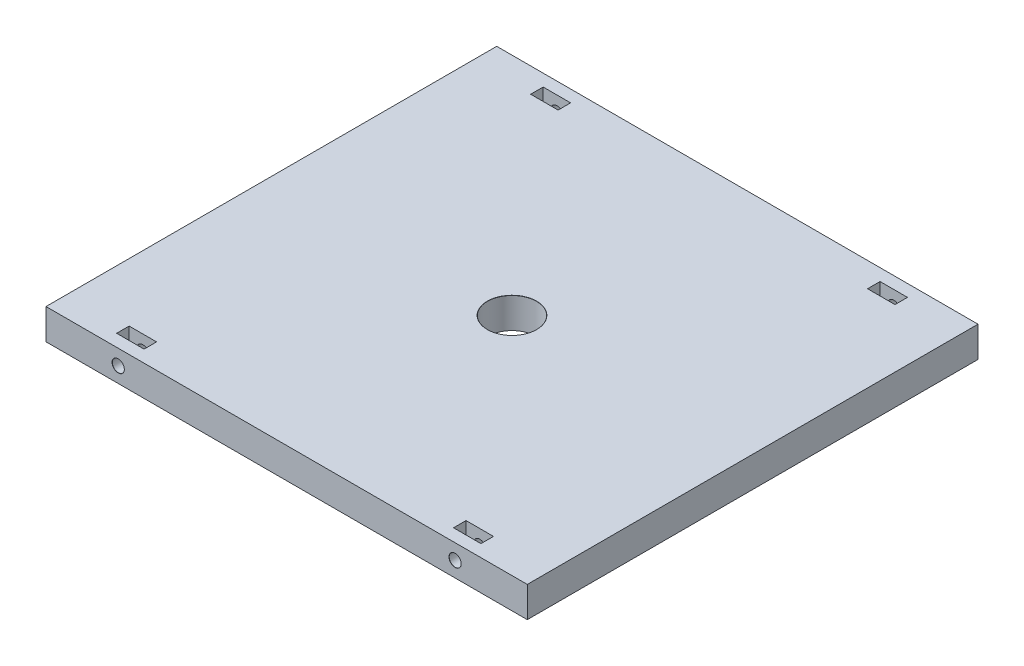
ISO-10303-21;
HEADER;
FILE_DESCRIPTION(('STEP AP214'),'2;1');
FILE_NAME('part.step','',(''),(''),'','','');
FILE_SCHEMA(('AUTOMOTIVE_DESIGN { 1 0 10303 214 1 1 1 1 }'));
ENDSEC;
DATA;
#1=APPLICATION_CONTEXT('core data for automotive mechanical design processes');
#2=APPLICATION_PROTOCOL_DEFINITION('international standard','automotive_design',2000,#1);
#3=PRODUCT_CONTEXT('',#1,'mechanical');
#4=PRODUCT('Part','Part','',(#3));
#5=PRODUCT_RELATED_PRODUCT_CATEGORY('part','',(#4));
#6=PRODUCT_DEFINITION_FORMATION('','',#4);
#7=PRODUCT_DEFINITION_CONTEXT('part definition',#1,'design');
#8=PRODUCT_DEFINITION('design','',#6,#7);
#9=PRODUCT_DEFINITION_SHAPE('','',#8);
#10=(LENGTH_UNIT() NAMED_UNIT(*) SI_UNIT(.MILLI.,.METRE.));
#11=(NAMED_UNIT(*) PLANE_ANGLE_UNIT() SI_UNIT($,.RADIAN.));
#12=(NAMED_UNIT(*) SI_UNIT($,.STERADIAN.) SOLID_ANGLE_UNIT());
#13=UNCERTAINTY_MEASURE_WITH_UNIT(LENGTH_MEASURE(1.E-05),#10,'distance_accuracy_value','');
#14=(GEOMETRIC_REPRESENTATION_CONTEXT(3) GLOBAL_UNCERTAINTY_ASSIGNED_CONTEXT((#13)) GLOBAL_UNIT_ASSIGNED_CONTEXT((#10,
#11,#12)) REPRESENTATION_CONTEXT('',''));
#15=CARTESIAN_POINT('',(0.,0.,0.));
#16=DIRECTION('',(0.,0.,1.));
#17=DIRECTION('',(1.,0.,0.));
#18=AXIS2_PLACEMENT_3D('',#15,#16,#17);
#19=CARTESIAN_POINT('',(35.,3.175,46.825));
#20=DIRECTION('',(0.,0.,1.));
#21=DIRECTION('',(1.,0.,0.));
#22=AXIS2_PLACEMENT_3D('',#19,#20,#21);
#23=CYLINDRICAL_SURFACE('',#22,1.24999999999999);
#24=CARTESIAN_POINT('',(35.,3.175,44.3));
#25=DIRECTION('',(0.,0.,1.));
#26=DIRECTION('',(1.,0.,0.));
#27=AXIS2_PLACEMENT_3D('',#24,#25,#26);
#28=CIRCLE('',#27,1.24999999999999);
#29=CARTESIAN_POINT('',(36.25,3.175,44.3));
#30=VERTEX_POINT('',#29);
#31=EDGE_CURVE('E46',#30,#30,#28,.F.);
#32=ORIENTED_EDGE('',*,*,#31,.T.);
#33=EDGE_LOOP('',(#32));
#34=FACE_BOUND('',#33,.T.);
#35=CARTESIAN_POINT('',(35.,3.175,46.8));
#36=DIRECTION('',(0.,0.,1.));
#37=DIRECTION('',(1.,0.,0.));
#38=AXIS2_PLACEMENT_3D('',#35,#36,#37);
#39=CIRCLE('',#38,1.24999999999999);
#40=CARTESIAN_POINT('',(36.25,3.175,46.8));
#41=VERTEX_POINT('',#40);
#42=EDGE_CURVE('E423',#41,#41,#39,.T.);
#43=ORIENTED_EDGE('',*,*,#42,.T.);
#44=EDGE_LOOP('',(#43));
#45=FACE_BOUND('',#44,.T.);
#46=ADVANCED_FACE('F42',(#34,#45),#23,.F.);
#47=CARTESIAN_POINT('',(-35.,3.175,46.825));
#48=DIRECTION('',(0.,0.,1.));
#49=DIRECTION('',(1.,0.,0.));
#50=AXIS2_PLACEMENT_3D('',#47,#48,#49);
#51=CYLINDRICAL_SURFACE('',#50,1.24999999999999);
#52=CARTESIAN_POINT('',(-35.,3.175,44.3));
#53=DIRECTION('',(0.,0.,1.));
#54=DIRECTION('',(1.,0.,0.));
#55=AXIS2_PLACEMENT_3D('',#52,#53,#54);
#56=CIRCLE('',#55,1.24999999999999);
#57=CARTESIAN_POINT('',(-33.75,3.175,44.3));
#58=VERTEX_POINT('',#57);
#59=EDGE_CURVE('E487',#58,#58,#56,.F.);
#60=ORIENTED_EDGE('',*,*,#59,.T.);
#61=EDGE_LOOP('',(#60));
#62=FACE_BOUND('',#61,.T.);
#63=CARTESIAN_POINT('',(-35.,3.175,46.8));
#64=DIRECTION('',(0.,0.,1.));
#65=DIRECTION('',(1.,0.,0.));
#66=AXIS2_PLACEMENT_3D('',#63,#64,#65);
#67=CIRCLE('',#66,1.24999999999999);
#68=CARTESIAN_POINT('',(-33.75,3.175,46.8));
#69=VERTEX_POINT('',#68);
#70=EDGE_CURVE('E411',#69,#69,#67,.T.);
#71=ORIENTED_EDGE('',*,*,#70,.T.);
#72=EDGE_LOOP('',(#71));
#73=FACE_BOUND('',#72,.T.);
#74=ADVANCED_FACE('F519',(#62,#73),#51,.F.);
#75=CARTESIAN_POINT('',(50.,6.35,46.825));
#76=DIRECTION('',(-1.,0.,0.));
#77=DIRECTION('',(0.,0.,1.));
#78=AXIS2_PLACEMENT_3D('',#75,#76,#77);
#79=PLANE('',#78);
#80=DIRECTION('',(0.,0.,-1.));
#81=VECTOR('',#80,1.);
#82=CARTESIAN_POINT('',(50.,0.,46.825));
#83=LINE('',#82,#81);
#84=CARTESIAN_POINT('',(50.,0.,46.825));
#85=VERTEX_POINT('',#84);
#86=CARTESIAN_POINT('',(50.,0.,-46.825));
#87=VERTEX_POINT('',#86);
#88=EDGE_CURVE('E431',#85,#87,#83,.T.);
#89=ORIENTED_EDGE('',*,*,#88,.T.);
#90=DIRECTION('',(0.,-1.,0.));
#91=VECTOR('',#90,1.);
#92=CARTESIAN_POINT('',(50.,6.35,-46.825));
#93=LINE('',#92,#91);
#94=CARTESIAN_POINT('',(50.,6.35,-46.825));
#95=VERTEX_POINT('',#94);
#96=EDGE_CURVE('E11',#95,#87,#93,.T.);
#97=ORIENTED_EDGE('',*,*,#96,.F.);
#98=DIRECTION('',(0.,0.,-1.));
#99=VECTOR('',#98,1.);
#100=CARTESIAN_POINT('',(50.,6.35,46.825));
#101=LINE('',#100,#99);
#102=CARTESIAN_POINT('',(50.,6.35,46.825));
#103=VERTEX_POINT('',#102);
#104=EDGE_CURVE('E432',#103,#95,#101,.T.);
#105=ORIENTED_EDGE('',*,*,#104,.F.);
#106=DIRECTION('',(0.,-1.,0.));
#107=VECTOR('',#106,1.);
#108=CARTESIAN_POINT('',(50.,6.35,46.825));
#109=LINE('',#108,#107);
#110=EDGE_CURVE('E446',#103,#85,#109,.T.);
#111=ORIENTED_EDGE('',*,*,#110,.T.);
#112=EDGE_LOOP('',(#89,#97,#105,#111));
#113=FACE_BOUND('',#112,.T.);
#114=ADVANCED_FACE('F44',(#113),#79,.F.);
#115=CARTESIAN_POINT('',(-50.,6.35,-46.825));
#116=DIRECTION('',(0.,0.,1.));
#117=DIRECTION('',(1.,0.,0.));
#118=AXIS2_PLACEMENT_3D('',#115,#116,#117);
#119=PLANE('',#118);
#120=CARTESIAN_POINT('',(35.,3.175,-46.825));
#121=DIRECTION('',(0.,0.,-1.));
#122=DIRECTION('',(-1.,0.,0.));
#123=AXIS2_PLACEMENT_3D('',#120,#121,#122);
#124=CIRCLE('',#123,1.275);
#125=CARTESIAN_POINT('',(33.725,3.175,-46.825));
#126=VERTEX_POINT('',#125);
#127=EDGE_CURVE('E383',#126,#126,#124,.T.);
#128=ORIENTED_EDGE('',*,*,#127,.F.);
#129=EDGE_LOOP('',(#128));
#130=FACE_BOUND('',#129,.T.);
#131=CARTESIAN_POINT('',(-35.,3.175,-46.825));
#132=DIRECTION('',(0.,0.,-1.));
#133=DIRECTION('',(-1.,0.,0.));
#134=AXIS2_PLACEMENT_3D('',#131,#132,#133);
#135=CIRCLE('',#134,1.275);
#136=CARTESIAN_POINT('',(-36.275,3.175,-46.825));
#137=VERTEX_POINT('',#136);
#138=EDGE_CURVE('E395',#137,#137,#135,.T.);
#139=ORIENTED_EDGE('',*,*,#138,.F.);
#140=EDGE_LOOP('',(#139));
#141=FACE_BOUND('',#140,.T.);
#142=DIRECTION('',(-1.,0.,0.));
#143=VECTOR('',#142,1.);
#144=CARTESIAN_POINT('',(-50.,0.,-46.825));
#145=LINE('',#144,#143);
#146=CARTESIAN_POINT('',(-50.,0.,-46.825));
#147=VERTEX_POINT('',#146);
#148=EDGE_CURVE('E450',#87,#147,#145,.T.);
#149=ORIENTED_EDGE('',*,*,#148,.T.);
#150=DIRECTION('',(0.,-1.,0.));
#151=VECTOR('',#150,1.);
#152=CARTESIAN_POINT('',(-50.,6.35,-46.825));
#153=LINE('',#152,#151);
#154=CARTESIAN_POINT('',(-50.,6.35,-46.825));
#155=VERTEX_POINT('',#154);
#156=EDGE_CURVE('E52',#155,#147,#153,.T.);
#157=ORIENTED_EDGE('',*,*,#156,.F.);
#158=DIRECTION('',(-1.,0.,0.));
#159=VECTOR('',#158,1.);
#160=CARTESIAN_POINT('',(-50.,6.35,-46.825));
#161=LINE('',#160,#159);
#162=EDGE_CURVE('E436',#95,#155,#161,.T.);
#163=ORIENTED_EDGE('',*,*,#162,.F.);
#164=ORIENTED_EDGE('',*,*,#96,.T.);
#165=EDGE_LOOP('',(#149,#157,#163,#164));
#166=FACE_BOUND('',#165,.T.);
#167=ADVANCED_FACE('F561',(#130,#141,#166),#119,.F.);
#168=CARTESIAN_POINT('',(-50.,6.35,46.825));
#169=DIRECTION('',(1.,0.,0.));
#170=DIRECTION('',(0.,0.,-1.));
#171=AXIS2_PLACEMENT_3D('',#168,#169,#170);
#172=PLANE('',#171);
#173=DIRECTION('',(0.,0.,1.));
#174=VECTOR('',#173,1.);
#175=CARTESIAN_POINT('',(-50.,0.,46.825));
#176=LINE('',#175,#174);
#177=CARTESIAN_POINT('',(-50.,0.,46.825));
#178=VERTEX_POINT('',#177);
#179=EDGE_CURVE('E453',#147,#178,#176,.T.);
#180=ORIENTED_EDGE('',*,*,#179,.T.);
#181=DIRECTION('',(0.,-1.,0.));
#182=VECTOR('',#181,1.);
#183=CARTESIAN_POINT('',(-50.,6.35,46.825));
#184=LINE('',#183,#182);
#185=CARTESIAN_POINT('',(-50.,6.35,46.825));
#186=VERTEX_POINT('',#185);
#187=EDGE_CURVE('E461',#186,#178,#184,.T.);
#188=ORIENTED_EDGE('',*,*,#187,.F.);
#189=DIRECTION('',(0.,0.,1.));
#190=VECTOR('',#189,1.);
#191=CARTESIAN_POINT('',(-50.,6.35,46.825));
#192=LINE('',#191,#190);
#193=EDGE_CURVE('E440',#155,#186,#192,.T.);
#194=ORIENTED_EDGE('',*,*,#193,.F.);
#195=ORIENTED_EDGE('',*,*,#156,.T.);
#196=EDGE_LOOP('',(#180,#188,#194,#195));
#197=FACE_BOUND('',#196,.T.);
#198=ADVANCED_FACE('F558',(#197),#172,.F.);
#199=CARTESIAN_POINT('',(-50.,6.35,46.825));
#200=DIRECTION('',(0.,0.,-1.));
#201=DIRECTION('',(-1.,0.,0.));
#202=AXIS2_PLACEMENT_3D('',#199,#200,#201);
#203=PLANE('',#202);
#204=CARTESIAN_POINT('',(-35.,3.175,46.825));
#205=DIRECTION('',(0.,0.,1.));
#206=DIRECTION('',(1.,0.,0.));
#207=AXIS2_PLACEMENT_3D('',#204,#205,#206);
#208=CIRCLE('',#207,1.275);
#209=CARTESIAN_POINT('',(-33.725,3.175,46.825));
#210=VERTEX_POINT('',#209);
#211=EDGE_CURVE('E407',#210,#210,#208,.T.);
#212=ORIENTED_EDGE('',*,*,#211,.F.);
#213=EDGE_LOOP('',(#212));
#214=FACE_BOUND('',#213,.T.);
#215=CARTESIAN_POINT('',(35.,3.175,46.825));
#216=DIRECTION('',(0.,0.,1.));
#217=DIRECTION('',(1.,0.,0.));
#218=AXIS2_PLACEMENT_3D('',#215,#216,#217);
#219=CIRCLE('',#218,1.275);
#220=CARTESIAN_POINT('',(36.275,3.175,46.825));
#221=VERTEX_POINT('',#220);
#222=EDGE_CURVE('E419',#221,#221,#219,.T.);
#223=ORIENTED_EDGE('',*,*,#222,.F.);
#224=EDGE_LOOP('',(#223));
#225=FACE_BOUND('',#224,.T.);
#226=DIRECTION('',(1.,0.,0.));
#227=VECTOR('',#226,1.);
#228=CARTESIAN_POINT('',(-50.,0.,46.825));
#229=LINE('',#228,#227);
#230=EDGE_CURVE('E437',#178,#85,#229,.T.);
#231=ORIENTED_EDGE('',*,*,#230,.T.);
#232=ORIENTED_EDGE('',*,*,#110,.F.);
#233=DIRECTION('',(1.,0.,0.));
#234=VECTOR('',#233,1.);
#235=CARTESIAN_POINT('',(-50.,6.35,46.825));
#236=LINE('',#235,#234);
#237=EDGE_CURVE('E443',#186,#103,#236,.T.);
#238=ORIENTED_EDGE('',*,*,#237,.F.);
#239=ORIENTED_EDGE('',*,*,#187,.T.);
#240=EDGE_LOOP('',(#231,#232,#238,#239));
#241=FACE_BOUND('',#240,.T.);
#242=ADVANCED_FACE('F550',(#214,#225,#241),#203,.F.);
#243=CARTESIAN_POINT('',(0.,6.35,0.));
#244=DIRECTION('',(0.,-1.,0.));
#245=DIRECTION('',(0.,0.,-1.));
#246=AXIS2_PLACEMENT_3D('',#243,#244,#245);
#247=PLANE('',#246);
#248=DIRECTION('',(-1.,0.,0.));
#249=VECTOR('',#248,1.);
#250=CARTESIAN_POINT('',(32.15,6.35,-44.325));
#251=LINE('',#250,#249);
#252=CARTESIAN_POINT('',(37.85,6.35,-44.325));
#253=VERTEX_POINT('',#252);
#254=CARTESIAN_POINT('',(32.15,6.35,-44.325));
#255=VERTEX_POINT('',#254);
#256=EDGE_CURVE('E310',#253,#255,#251,.T.);
#257=ORIENTED_EDGE('',*,*,#256,.F.);
#258=DIRECTION('',(0.,0.,-1.));
#259=VECTOR('',#258,1.);
#260=CARTESIAN_POINT('',(37.85,6.35,-44.325));
#261=LINE('',#260,#259);
#262=CARTESIAN_POINT('',(37.85,6.35,-41.725));
#263=VERTEX_POINT('',#262);
#264=EDGE_CURVE('E60',#263,#253,#261,.T.);
#265=ORIENTED_EDGE('',*,*,#264,.F.);
#266=DIRECTION('',(1.,0.,0.));
#267=VECTOR('',#266,1.);
#268=CARTESIAN_POINT('',(32.15,6.35,-41.725));
#269=LINE('',#268,#267);
#270=CARTESIAN_POINT('',(32.15,6.35,-41.725));
#271=VERTEX_POINT('',#270);
#272=EDGE_CURVE('E301',#271,#263,#269,.T.);
#273=ORIENTED_EDGE('',*,*,#272,.F.);
#274=DIRECTION('',(0.,0.,1.));
#275=VECTOR('',#274,1.);
#276=CARTESIAN_POINT('',(32.15,6.35,-44.325));
#277=LINE('',#276,#275);
#278=EDGE_CURVE('E305',#255,#271,#277,.T.);
#279=ORIENTED_EDGE('',*,*,#278,.F.);
#280=EDGE_LOOP('',(#257,#265,#273,#279));
#281=FACE_BOUND('',#280,.T.);
#282=DIRECTION('',(-1.,0.,0.));
#283=VECTOR('',#282,1.);
#284=CARTESIAN_POINT('',(-37.85,6.35,-44.325));
#285=LINE('',#284,#283);
#286=CARTESIAN_POINT('',(-32.15,6.35,-44.325));
#287=VERTEX_POINT('',#286);
#288=CARTESIAN_POINT('',(-37.85,6.35,-44.325));
#289=VERTEX_POINT('',#288);
#290=EDGE_CURVE('E268',#287,#289,#285,.T.);
#291=ORIENTED_EDGE('',*,*,#290,.F.);
#292=DIRECTION('',(0.,0.,-1.));
#293=VECTOR('',#292,1.);
#294=CARTESIAN_POINT('',(-32.15,6.35,-44.325));
#295=LINE('',#294,#293);
#296=CARTESIAN_POINT('',(-32.15,6.35,-41.725));
#297=VERTEX_POINT('',#296);
#298=EDGE_CURVE('E68',#297,#287,#295,.T.);
#299=ORIENTED_EDGE('',*,*,#298,.F.);
#300=DIRECTION('',(1.,0.,0.));
#301=VECTOR('',#300,1.);
#302=CARTESIAN_POINT('',(-37.85,6.35,-41.725));
#303=LINE('',#302,#301);
#304=CARTESIAN_POINT('',(-37.85,6.35,-41.725));
#305=VERTEX_POINT('',#304);
#306=EDGE_CURVE('E259',#305,#297,#303,.T.);
#307=ORIENTED_EDGE('',*,*,#306,.F.);
#308=DIRECTION('',(0.,0.,1.));
#309=VECTOR('',#308,1.);
#310=CARTESIAN_POINT('',(-37.85,6.35,-44.325));
#311=LINE('',#310,#309);
#312=EDGE_CURVE('E263',#289,#305,#311,.T.);
#313=ORIENTED_EDGE('',*,*,#312,.F.);
#314=EDGE_LOOP('',(#291,#299,#307,#313));
#315=FACE_BOUND('',#314,.T.);
#316=DIRECTION('',(-1.,0.,0.));
#317=VECTOR('',#316,1.);
#318=CARTESIAN_POINT('',(-37.85,6.35,41.7));
#319=LINE('',#318,#317);
#320=CARTESIAN_POINT('',(-32.15,6.35,41.7));
#321=VERTEX_POINT('',#320);
#322=CARTESIAN_POINT('',(-37.85,6.35,41.7));
#323=VERTEX_POINT('',#322);
#324=EDGE_CURVE('E221',#321,#323,#319,.T.);
#325=ORIENTED_EDGE('',*,*,#324,.F.);
#326=DIRECTION('',(0.,0.,-1.));
#327=VECTOR('',#326,1.);
#328=CARTESIAN_POINT('',(-32.15,6.35,44.3));
#329=LINE('',#328,#327);
#330=CARTESIAN_POINT('',(-32.15,6.35,44.3));
#331=VERTEX_POINT('',#330);
#332=EDGE_CURVE('E197',#331,#321,#329,.T.);
#333=ORIENTED_EDGE('',*,*,#332,.F.);
#334=DIRECTION('',(1.,0.,0.));
#335=VECTOR('',#334,1.);
#336=CARTESIAN_POINT('',(-37.85,6.35,44.3));
#337=LINE('',#336,#335);
#338=CARTESIAN_POINT('',(-37.85,6.35,44.3));
#339=VERTEX_POINT('',#338);
#340=EDGE_CURVE('E208',#339,#331,#337,.T.);
#341=ORIENTED_EDGE('',*,*,#340,.F.);
#342=DIRECTION('',(0.,0.,1.));
#343=VECTOR('',#342,1.);
#344=CARTESIAN_POINT('',(-37.85,6.35,44.3));
#345=LINE('',#344,#343);
#346=EDGE_CURVE('E215',#323,#339,#345,.T.);
#347=ORIENTED_EDGE('',*,*,#346,.F.);
#348=EDGE_LOOP('',(#325,#333,#341,#347));
#349=FACE_BOUND('',#348,.T.);
#350=DIRECTION('',(-1.,0.,0.));
#351=VECTOR('',#350,1.);
#352=CARTESIAN_POINT('',(32.15,6.35,41.7));
#353=LINE('',#352,#351);
#354=CARTESIAN_POINT('',(37.85,6.35,41.7));
#355=VERTEX_POINT('',#354);
#356=CARTESIAN_POINT('',(32.15,6.35,41.7));
#357=VERTEX_POINT('',#356);
#358=EDGE_CURVE('E227',#355,#357,#353,.T.);
#359=ORIENTED_EDGE('',*,*,#358,.F.);
#360=DIRECTION('',(0.,0.,-1.));
#361=VECTOR('',#360,1.);
#362=CARTESIAN_POINT('',(37.85,6.35,44.3));
#363=LINE('',#362,#361);
#364=CARTESIAN_POINT('',(37.85,6.35,44.3));
#365=VERTEX_POINT('',#364);
#366=EDGE_CURVE('E223',#365,#355,#363,.T.);
#367=ORIENTED_EDGE('',*,*,#366,.F.);
#368=DIRECTION('',(1.,0.,0.));
#369=VECTOR('',#368,1.);
#370=CARTESIAN_POINT('',(32.15,6.35,44.3));
#371=LINE('',#370,#369);
#372=CARTESIAN_POINT('',(32.15,6.35,44.3));
#373=VERTEX_POINT('',#372);
#374=EDGE_CURVE('E335',#373,#365,#371,.T.);
#375=ORIENTED_EDGE('',*,*,#374,.F.);
#376=DIRECTION('',(0.,0.,1.));
#377=VECTOR('',#376,1.);
#378=CARTESIAN_POINT('',(32.15,6.35,44.3));
#379=LINE('',#378,#377);
#380=EDGE_CURVE('E351',#357,#373,#379,.T.);
#381=ORIENTED_EDGE('',*,*,#380,.F.);
#382=EDGE_LOOP('',(#359,#367,#375,#381));
#383=FACE_BOUND('',#382,.T.);
#384=CARTESIAN_POINT('',(0.,6.35,0.));
#385=DIRECTION('',(0.,1.,0.));
#386=DIRECTION('',(0.,0.,1.));
#387=AXIS2_PLACEMENT_3D('',#384,#385,#386);
#388=CIRCLE('',#387,5.125);
#389=CARTESIAN_POINT('',(0.,6.35,5.125));
#390=VERTEX_POINT('',#389);
#391=EDGE_CURVE('E371',#390,#390,#388,.T.);
#392=ORIENTED_EDGE('',*,*,#391,.F.);
#393=EDGE_LOOP('',(#392));
#394=FACE_BOUND('',#393,.T.);
#395=ORIENTED_EDGE('',*,*,#104,.T.);
#396=ORIENTED_EDGE('',*,*,#162,.T.);
#397=ORIENTED_EDGE('',*,*,#193,.T.);
#398=ORIENTED_EDGE('',*,*,#237,.T.);
#399=EDGE_LOOP('',(#395,#396,#397,#398));
#400=FACE_BOUND('',#399,.T.);
#401=ADVANCED_FACE('F218',(#281,#315,#349,#383,#394,#400),#247,.F.);
#402=CARTESIAN_POINT('',(0.,0.,0.));
#403=DIRECTION('',(0.,-1.,0.));
#404=DIRECTION('',(0.,0.,-1.));
#405=AXIS2_PLACEMENT_3D('',#402,#403,#404);
#406=PLANE('',#405);
#407=DIRECTION('',(0.,0.,-1.));
#408=VECTOR('',#407,1.);
#409=CARTESIAN_POINT('',(37.85,0.,-44.325));
#410=LINE('',#409,#408);
#411=CARTESIAN_POINT('',(37.85,0.,-41.725));
#412=VERTEX_POINT('',#411);
#413=CARTESIAN_POINT('',(37.85,0.,-44.325));
#414=VERTEX_POINT('',#413);
#415=EDGE_CURVE('E306',#412,#414,#410,.T.);
#416=ORIENTED_EDGE('',*,*,#415,.T.);
#417=DIRECTION('',(-1.,0.,0.));
#418=VECTOR('',#417,1.);
#419=CARTESIAN_POINT('',(32.15,0.,-44.325));
#420=LINE('',#419,#418);
#421=CARTESIAN_POINT('',(32.15,0.,-44.325));
#422=VERTEX_POINT('',#421);
#423=EDGE_CURVE('E323',#414,#422,#420,.T.);
#424=ORIENTED_EDGE('',*,*,#423,.T.);
#425=DIRECTION('',(0.,0.,1.));
#426=VECTOR('',#425,1.);
#427=CARTESIAN_POINT('',(32.15,0.,-44.325));
#428=LINE('',#427,#426);
#429=CARTESIAN_POINT('',(32.15,0.,-41.725));
#430=VERTEX_POINT('',#429);
#431=EDGE_CURVE('E319',#422,#430,#428,.T.);
#432=ORIENTED_EDGE('',*,*,#431,.T.);
#433=DIRECTION('',(1.,0.,0.));
#434=VECTOR('',#433,1.);
#435=CARTESIAN_POINT('',(32.15,0.,-41.725));
#436=LINE('',#435,#434);
#437=EDGE_CURVE('E291',#430,#412,#436,.T.);
#438=ORIENTED_EDGE('',*,*,#437,.T.);
#439=EDGE_LOOP('',(#416,#424,#432,#438));
#440=FACE_BOUND('',#439,.T.);
#441=DIRECTION('',(0.,0.,-1.));
#442=VECTOR('',#441,1.);
#443=CARTESIAN_POINT('',(-32.15,0.,-44.325));
#444=LINE('',#443,#442);
#445=CARTESIAN_POINT('',(-32.15,0.,-41.725));
#446=VERTEX_POINT('',#445);
#447=CARTESIAN_POINT('',(-32.15,0.,-44.325));
#448=VERTEX_POINT('',#447);
#449=EDGE_CURVE('E264',#446,#448,#444,.T.);
#450=ORIENTED_EDGE('',*,*,#449,.T.);
#451=DIRECTION('',(-1.,0.,0.));
#452=VECTOR('',#451,1.);
#453=CARTESIAN_POINT('',(-37.85,0.,-44.325));
#454=LINE('',#453,#452);
#455=CARTESIAN_POINT('',(-37.85,0.,-44.325));
#456=VERTEX_POINT('',#455);
#457=EDGE_CURVE('E281',#448,#456,#454,.T.);
#458=ORIENTED_EDGE('',*,*,#457,.T.);
#459=DIRECTION('',(0.,0.,1.));
#460=VECTOR('',#459,1.);
#461=CARTESIAN_POINT('',(-37.85,0.,-44.325));
#462=LINE('',#461,#460);
#463=CARTESIAN_POINT('',(-37.85,0.,-41.725));
#464=VERTEX_POINT('',#463);
#465=EDGE_CURVE('E277',#456,#464,#462,.T.);
#466=ORIENTED_EDGE('',*,*,#465,.T.);
#467=DIRECTION('',(1.,0.,0.));
#468=VECTOR('',#467,1.);
#469=CARTESIAN_POINT('',(-37.85,0.,-41.725));
#470=LINE('',#469,#468);
#471=EDGE_CURVE('E249',#464,#446,#470,.T.);
#472=ORIENTED_EDGE('',*,*,#471,.T.);
#473=EDGE_LOOP('',(#450,#458,#466,#472));
#474=FACE_BOUND('',#473,.T.);
#475=DIRECTION('',(0.,0.,-1.));
#476=VECTOR('',#475,1.);
#477=CARTESIAN_POINT('',(-32.15,0.,44.3));
#478=LINE('',#477,#476);
#479=CARTESIAN_POINT('',(-32.15,0.,44.3));
#480=VERTEX_POINT('',#479);
#481=CARTESIAN_POINT('',(-32.15,0.,41.7));
#482=VERTEX_POINT('',#481);
#483=EDGE_CURVE('E200',#480,#482,#478,.T.);
#484=ORIENTED_EDGE('',*,*,#483,.T.);
#485=DIRECTION('',(-1.,0.,0.));
#486=VECTOR('',#485,1.);
#487=CARTESIAN_POINT('',(-37.85,0.,41.7));
#488=LINE('',#487,#486);
#489=CARTESIAN_POINT('',(-37.85,0.,41.7));
#490=VERTEX_POINT('',#489);
#491=EDGE_CURVE('E240',#482,#490,#488,.T.);
#492=ORIENTED_EDGE('',*,*,#491,.T.);
#493=DIRECTION('',(0.,0.,1.));
#494=VECTOR('',#493,1.);
#495=CARTESIAN_POINT('',(-37.85,0.,44.3));
#496=LINE('',#495,#494);
#497=CARTESIAN_POINT('',(-37.85,0.,44.3));
#498=VERTEX_POINT('',#497);
#499=EDGE_CURVE('E235',#490,#498,#496,.T.);
#500=ORIENTED_EDGE('',*,*,#499,.T.);
#501=DIRECTION('',(1.,0.,0.));
#502=VECTOR('',#501,1.);
#503=CARTESIAN_POINT('',(-37.85,0.,44.3));
#504=LINE('',#503,#502);
#505=EDGE_CURVE('E232',#498,#480,#504,.T.);
#506=ORIENTED_EDGE('',*,*,#505,.T.);
#507=EDGE_LOOP('',(#484,#492,#500,#506));
#508=FACE_BOUND('',#507,.T.);
#509=DIRECTION('',(0.,0.,-1.));
#510=VECTOR('',#509,1.);
#511=CARTESIAN_POINT('',(37.85,0.,44.3));
#512=LINE('',#511,#510);
#513=CARTESIAN_POINT('',(37.85,0.,44.3));
#514=VERTEX_POINT('',#513);
#515=CARTESIAN_POINT('',(37.85,0.,41.7));
#516=VERTEX_POINT('',#515);
#517=EDGE_CURVE('E330',#514,#516,#512,.T.);
#518=ORIENTED_EDGE('',*,*,#517,.T.);
#519=DIRECTION('',(-1.,0.,0.));
#520=VECTOR('',#519,1.);
#521=CARTESIAN_POINT('',(32.15,0.,41.7));
#522=LINE('',#521,#520);
#523=CARTESIAN_POINT('',(32.15,0.,41.7));
#524=VERTEX_POINT('',#523);
#525=EDGE_CURVE('E334',#516,#524,#522,.T.);
#526=ORIENTED_EDGE('',*,*,#525,.T.);
#527=DIRECTION('',(0.,0.,1.));
#528=VECTOR('',#527,1.);
#529=CARTESIAN_POINT('',(32.15,0.,44.3));
#530=LINE('',#529,#528);
#531=CARTESIAN_POINT('',(32.15,0.,44.3));
#532=VERTEX_POINT('',#531);
#533=EDGE_CURVE('E339',#524,#532,#530,.T.);
#534=ORIENTED_EDGE('',*,*,#533,.T.);
#535=DIRECTION('',(1.,0.,0.));
#536=VECTOR('',#535,1.);
#537=CARTESIAN_POINT('',(32.15,0.,44.3));
#538=LINE('',#537,#536);
#539=EDGE_CURVE('E343',#532,#514,#538,.T.);
#540=ORIENTED_EDGE('',*,*,#539,.T.);
#541=EDGE_LOOP('',(#518,#526,#534,#540));
#542=FACE_BOUND('',#541,.T.);
#543=CARTESIAN_POINT('',(0.,0.,0.));
#544=DIRECTION('',(0.,1.,0.));
#545=DIRECTION('',(0.,0.,1.));
#546=AXIS2_PLACEMENT_3D('',#543,#544,#545);
#547=CIRCLE('',#546,5.1);
#548=CARTESIAN_POINT('',(0.,0.,5.1));
#549=VERTEX_POINT('',#548);
#550=EDGE_CURVE('E379',#549,#549,#547,.T.);
#551=ORIENTED_EDGE('',*,*,#550,.T.);
#552=EDGE_LOOP('',(#551));
#553=FACE_BOUND('',#552,.T.);
#554=ORIENTED_EDGE('',*,*,#88,.F.);
#555=ORIENTED_EDGE('',*,*,#230,.F.);
#556=ORIENTED_EDGE('',*,*,#179,.F.);
#557=ORIENTED_EDGE('',*,*,#148,.F.);
#558=EDGE_LOOP('',(#554,#555,#556,#557));
#559=FACE_BOUND('',#558,.T.);
#560=ADVANCED_FACE('F549',(#440,#474,#508,#542,#553,#559),#406,.T.);
#561=CARTESIAN_POINT('',(35.,3.175,46.825));
#562=DIRECTION('',(0.,0.,1.));
#563=DIRECTION('',(1.,0.,0.));
#564=AXIS2_PLACEMENT_3D('',#561,#562,#563);
#565=CONICAL_SURFACE('',#564,1.275,0.785398163398003);
#566=ORIENTED_EDGE('',*,*,#42,.F.);
#567=EDGE_LOOP('',(#566));
#568=FACE_BOUND('',#567,.T.);
#569=ORIENTED_EDGE('',*,*,#222,.T.);
#570=EDGE_LOOP('',(#569));
#571=FACE_BOUND('',#570,.T.);
#572=ADVANCED_FACE('F554',(#568,#571),#565,.F.);
#573=CARTESIAN_POINT('',(-35.,3.175,46.825));
#574=DIRECTION('',(0.,0.,1.));
#575=DIRECTION('',(1.,0.,0.));
#576=AXIS2_PLACEMENT_3D('',#573,#574,#575);
#577=CONICAL_SURFACE('',#576,1.275,0.785398163398003);
#578=ORIENTED_EDGE('',*,*,#70,.F.);
#579=EDGE_LOOP('',(#578));
#580=FACE_BOUND('',#579,.T.);
#581=ORIENTED_EDGE('',*,*,#211,.T.);
#582=EDGE_LOOP('',(#581));
#583=FACE_BOUND('',#582,.T.);
#584=ADVANCED_FACE('F603',(#580,#583),#577,.F.);
#585=CARTESIAN_POINT('',(-35.,3.175,-46.825));
#586=DIRECTION('',(0.,0.,-1.));
#587=DIRECTION('',(-1.,0.,0.));
#588=AXIS2_PLACEMENT_3D('',#585,#586,#587);
#589=CYLINDRICAL_SURFACE('',#588,1.24999999999999);
#590=CARTESIAN_POINT('',(-35.,3.175,-44.325));
#591=DIRECTION('',(0.,0.,-1.));
#592=DIRECTION('',(-1.,0.,0.));
#593=AXIS2_PLACEMENT_3D('',#590,#591,#592);
#594=CIRCLE('',#593,1.24999999999999);
#595=CARTESIAN_POINT('',(-36.25,3.175,-44.325));
#596=VERTEX_POINT('',#595);
#597=EDGE_CURVE('E475',#596,#596,#594,.F.);
#598=ORIENTED_EDGE('',*,*,#597,.T.);
#599=EDGE_LOOP('',(#598));
#600=FACE_BOUND('',#599,.T.);
#601=CARTESIAN_POINT('',(-35.,3.175,-46.8));
#602=DIRECTION('',(0.,0.,-1.));
#603=DIRECTION('',(-1.,0.,0.));
#604=AXIS2_PLACEMENT_3D('',#601,#602,#603);
#605=CIRCLE('',#604,1.24999999999999);
#606=CARTESIAN_POINT('',(-36.25,3.175,-46.8));
#607=VERTEX_POINT('',#606);
#608=EDGE_CURVE('E399',#607,#607,#605,.T.);
#609=ORIENTED_EDGE('',*,*,#608,.T.);
#610=EDGE_LOOP('',(#609));
#611=FACE_BOUND('',#610,.T.);
#612=ADVANCED_FACE('F590',(#600,#611),#589,.F.);
#613=CARTESIAN_POINT('',(-35.,3.175,-46.825));
#614=DIRECTION('',(0.,0.,-1.));
#615=DIRECTION('',(-1.,0.,0.));
#616=AXIS2_PLACEMENT_3D('',#613,#614,#615);
#617=CONICAL_SURFACE('',#616,1.275,0.785398163398003);
#618=ORIENTED_EDGE('',*,*,#608,.F.);
#619=EDGE_LOOP('',(#618));
#620=FACE_BOUND('',#619,.T.);
#621=ORIENTED_EDGE('',*,*,#138,.T.);
#622=EDGE_LOOP('',(#621));
#623=FACE_BOUND('',#622,.T.);
#624=ADVANCED_FACE('F587',(#620,#623),#617,.F.);
#625=CARTESIAN_POINT('',(35.,3.175,-46.825));
#626=DIRECTION('',(0.,0.,-1.));
#627=DIRECTION('',(-1.,0.,0.));
#628=AXIS2_PLACEMENT_3D('',#625,#626,#627);
#629=CYLINDRICAL_SURFACE('',#628,1.24999999999999);
#630=CARTESIAN_POINT('',(35.,3.175,-44.325));
#631=DIRECTION('',(0.,0.,-1.));
#632=DIRECTION('',(-1.,0.,0.));
#633=AXIS2_PLACEMENT_3D('',#630,#631,#632);
#634=CIRCLE('',#633,1.24999999999999);
#635=CARTESIAN_POINT('',(33.75,3.175,-44.325));
#636=VERTEX_POINT('',#635);
#637=EDGE_CURVE('E361',#636,#636,#634,.F.);
#638=ORIENTED_EDGE('',*,*,#637,.T.);
#639=EDGE_LOOP('',(#638));
#640=FACE_BOUND('',#639,.T.);
#641=CARTESIAN_POINT('',(35.,3.175,-46.8));
#642=DIRECTION('',(0.,0.,-1.));
#643=DIRECTION('',(-1.,0.,0.));
#644=AXIS2_PLACEMENT_3D('',#641,#642,#643);
#645=CIRCLE('',#644,1.24999999999999);
#646=CARTESIAN_POINT('',(33.75,3.175,-46.8));
#647=VERTEX_POINT('',#646);
#648=EDGE_CURVE('E387',#647,#647,#645,.T.);
#649=ORIENTED_EDGE('',*,*,#648,.T.);
#650=EDGE_LOOP('',(#649));
#651=FACE_BOUND('',#650,.T.);
#652=ADVANCED_FACE('F589',(#640,#651),#629,.F.);
#653=CARTESIAN_POINT('',(35.,3.175,-46.825));
#654=DIRECTION('',(0.,0.,-1.));
#655=DIRECTION('',(-1.,0.,0.));
#656=AXIS2_PLACEMENT_3D('',#653,#654,#655);
#657=CONICAL_SURFACE('',#656,1.275,0.785398163398003);
#658=ORIENTED_EDGE('',*,*,#648,.F.);
#659=EDGE_LOOP('',(#658));
#660=FACE_BOUND('',#659,.T.);
#661=ORIENTED_EDGE('',*,*,#127,.T.);
#662=EDGE_LOOP('',(#661));
#663=FACE_BOUND('',#662,.T.);
#664=ADVANCED_FACE('F598',(#660,#663),#657,.F.);
#665=CARTESIAN_POINT('',(0.,6.35,0.));
#666=DIRECTION('',(0.,1.,0.));
#667=DIRECTION('',(0.,0.,1.));
#668=AXIS2_PLACEMENT_3D('',#665,#666,#667);
#669=CYLINDRICAL_SURFACE('',#668,5.1);
#670=ORIENTED_EDGE('',*,*,#550,.F.);
#671=EDGE_LOOP('',(#670));
#672=FACE_BOUND('',#671,.T.);
#673=CARTESIAN_POINT('',(0.,6.32499999999999,0.));
#674=DIRECTION('',(0.,1.,0.));
#675=DIRECTION('',(0.,0.,1.));
#676=AXIS2_PLACEMENT_3D('',#673,#674,#675);
#677=CIRCLE('',#676,5.1);
#678=CARTESIAN_POINT('',(0.,6.32499999999999,5.1));
#679=VERTEX_POINT('',#678);
#680=EDGE_CURVE('E375',#679,#679,#677,.T.);
#681=ORIENTED_EDGE('',*,*,#680,.T.);
#682=EDGE_LOOP('',(#681));
#683=FACE_BOUND('',#682,.T.);
#684=ADVANCED_FACE('F852',(#672,#683),#669,.F.);
#685=CARTESIAN_POINT('',(0.,6.35,0.));
#686=DIRECTION('',(0.,1.,0.));
#687=DIRECTION('',(0.,0.,1.));
#688=AXIS2_PLACEMENT_3D('',#685,#686,#687);
#689=CONICAL_SURFACE('',#688,5.125,0.785398163397275);
#690=ORIENTED_EDGE('',*,*,#680,.F.);
#691=EDGE_LOOP('',(#690));
#692=FACE_BOUND('',#691,.T.);
#693=ORIENTED_EDGE('',*,*,#391,.T.);
#694=EDGE_LOOP('',(#693));
#695=FACE_BOUND('',#694,.T.);
#696=ADVANCED_FACE('F672',(#692,#695),#689,.F.);
#697=CARTESIAN_POINT('',(32.15,0.,-41.725));
#698=DIRECTION('',(0.,0.,1.));
#699=DIRECTION('',(1.,0.,0.));
#700=AXIS2_PLACEMENT_3D('',#697,#698,#699);
#701=PLANE('',#700);
#702=ORIENTED_EDGE('',*,*,#272,.T.);
#703=DIRECTION('',(0.,1.,0.));
#704=VECTOR('',#703,1.);
#705=CARTESIAN_POINT('',(37.85,0.,-41.725));
#706=LINE('',#705,#704);
#707=EDGE_CURVE('E298',#412,#263,#706,.T.);
#708=ORIENTED_EDGE('',*,*,#707,.F.);
#709=ORIENTED_EDGE('',*,*,#437,.F.);
#710=DIRECTION('',(0.,1.,0.));
#711=VECTOR('',#710,1.);
#712=CARTESIAN_POINT('',(32.15,0.,-41.725));
#713=LINE('',#712,#711);
#714=EDGE_CURVE('E295',#430,#271,#713,.T.);
#715=ORIENTED_EDGE('',*,*,#714,.T.);
#716=EDGE_LOOP('',(#702,#708,#709,#715));
#717=FACE_BOUND('',#716,.T.);
#718=CARTESIAN_POINT('',(35.,3.175,-41.725));
#719=DIRECTION('',(0.,0.,1.));
#720=DIRECTION('',(1.,0.,0.));
#721=AXIS2_PLACEMENT_3D('',#718,#719,#720);
#722=CIRCLE('',#721,1.24999999999999);
#723=CARTESIAN_POINT('',(36.25,3.175,-41.725));
#724=VERTEX_POINT('',#723);
#725=EDGE_CURVE('E471',#724,#724,#722,.F.);
#726=ORIENTED_EDGE('',*,*,#725,.F.);
#727=EDGE_LOOP('',(#726));
#728=FACE_BOUND('',#727,.T.);
#729=ADVANCED_FACE('F666',(#717,#728),#701,.F.);
#730=CARTESIAN_POINT('',(32.15,0.,-44.325));
#731=DIRECTION('',(0.,0.,-1.));
#732=DIRECTION('',(-1.,0.,0.));
#733=AXIS2_PLACEMENT_3D('',#730,#731,#732);
#734=PLANE('',#733);
#735=ORIENTED_EDGE('',*,*,#256,.T.);
#736=DIRECTION('',(0.,1.,0.));
#737=VECTOR('',#736,1.);
#738=CARTESIAN_POINT('',(32.15,0.,-44.325));
#739=LINE('',#738,#737);
#740=EDGE_CURVE('E292',#422,#255,#739,.T.);
#741=ORIENTED_EDGE('',*,*,#740,.F.);
#742=ORIENTED_EDGE('',*,*,#423,.F.);
#743=DIRECTION('',(0.,1.,0.));
#744=VECTOR('',#743,1.);
#745=CARTESIAN_POINT('',(37.85,0.,-44.325));
#746=LINE('',#745,#744);
#747=EDGE_CURVE('E288',#414,#253,#746,.T.);
#748=ORIENTED_EDGE('',*,*,#747,.T.);
#749=EDGE_LOOP('',(#735,#741,#742,#748));
#750=FACE_BOUND('',#749,.T.);
#751=ORIENTED_EDGE('',*,*,#637,.F.);
#752=EDGE_LOOP('',(#751));
#753=FACE_BOUND('',#752,.T.);
#754=ADVANCED_FACE('F671',(#750,#753),#734,.F.);
#755=CARTESIAN_POINT('',(37.85,0.,-44.325));
#756=DIRECTION('',(1.,0.,0.));
#757=DIRECTION('',(0.,0.,-1.));
#758=AXIS2_PLACEMENT_3D('',#755,#756,#757);
#759=PLANE('',#758);
#760=ORIENTED_EDGE('',*,*,#264,.T.);
#761=ORIENTED_EDGE('',*,*,#747,.F.);
#762=ORIENTED_EDGE('',*,*,#415,.F.);
#763=ORIENTED_EDGE('',*,*,#707,.T.);
#764=EDGE_LOOP('',(#760,#761,#762,#763));
#765=FACE_BOUND('',#764,.T.);
#766=ADVANCED_FACE('F683',(#765),#759,.F.);
#767=CARTESIAN_POINT('',(32.15,0.,-44.325));
#768=DIRECTION('',(-1.,0.,0.));
#769=DIRECTION('',(0.,0.,1.));
#770=AXIS2_PLACEMENT_3D('',#767,#768,#769);
#771=PLANE('',#770);
#772=ORIENTED_EDGE('',*,*,#278,.T.);
#773=ORIENTED_EDGE('',*,*,#714,.F.);
#774=ORIENTED_EDGE('',*,*,#431,.F.);
#775=ORIENTED_EDGE('',*,*,#740,.T.);
#776=EDGE_LOOP('',(#772,#773,#774,#775));
#777=FACE_BOUND('',#776,.T.);
#778=ADVANCED_FACE('F694',(#777),#771,.F.);
#779=CARTESIAN_POINT('',(35.,3.175,-37.5760757737845));
#780=DIRECTION('',(0.,0.,-1.));
#781=DIRECTION('',(-1.,0.,0.));
#782=AXIS2_PLACEMENT_3D('',#779,#780,#781);
#783=CONICAL_SURFACE('',#782,1.24999999999999,1.02974425867665);
#784=CARTESIAN_POINT('',(35.,3.175,-36.825));
#785=VERTEX_POINT('',#784);
#786=VERTEX_LOOP('',#785);
#787=FACE_BOUND('',#786,.T.);
#788=CARTESIAN_POINT('',(35.,3.175,-37.5760757737845));
#789=DIRECTION('',(0.,0.,-1.));
#790=DIRECTION('',(-1.,0.,0.));
#791=AXIS2_PLACEMENT_3D('',#788,#789,#790);
#792=CIRCLE('',#791,1.24999999999999);
#793=CARTESIAN_POINT('',(33.75,3.175,-37.5760757737845));
#794=VERTEX_POINT('',#793);
#795=EDGE_CURVE('E391',#794,#794,#792,.T.);
#796=ORIENTED_EDGE('',*,*,#795,.T.);
#797=EDGE_LOOP('',(#796));
#798=FACE_BOUND('',#797,.T.);
#799=ADVANCED_FACE('F609',(#787,#798),#783,.F.);
#800=ORIENTED_EDGE('',*,*,#725,.T.);
#801=EDGE_LOOP('',(#800));
#802=FACE_BOUND('',#801,.T.);
#803=ORIENTED_EDGE('',*,*,#795,.F.);
#804=EDGE_LOOP('',(#803));
#805=FACE_BOUND('',#804,.T.);
#806=ADVANCED_FACE('F601',(#802,#805),#629,.F.);
#807=CARTESIAN_POINT('',(-37.85,0.,-41.725));
#808=DIRECTION('',(0.,0.,1.));
#809=DIRECTION('',(1.,0.,0.));
#810=AXIS2_PLACEMENT_3D('',#807,#808,#809);
#811=PLANE('',#810);
#812=ORIENTED_EDGE('',*,*,#306,.T.);
#813=DIRECTION('',(0.,1.,0.));
#814=VECTOR('',#813,1.);
#815=CARTESIAN_POINT('',(-32.15,0.,-41.725));
#816=LINE('',#815,#814);
#817=EDGE_CURVE('E256',#446,#297,#816,.T.);
#818=ORIENTED_EDGE('',*,*,#817,.F.);
#819=ORIENTED_EDGE('',*,*,#471,.F.);
#820=DIRECTION('',(0.,1.,0.));
#821=VECTOR('',#820,1.);
#822=CARTESIAN_POINT('',(-37.85,0.,-41.725));
#823=LINE('',#822,#821);
#824=EDGE_CURVE('E253',#464,#305,#823,.T.);
#825=ORIENTED_EDGE('',*,*,#824,.T.);
#826=EDGE_LOOP('',(#812,#818,#819,#825));
#827=FACE_BOUND('',#826,.T.);
#828=CARTESIAN_POINT('',(-35.,3.175,-41.725));
#829=DIRECTION('',(0.,0.,1.));
#830=DIRECTION('',(1.,0.,0.));
#831=AXIS2_PLACEMENT_3D('',#828,#829,#830);
#832=CIRCLE('',#831,1.24999999999999);
#833=CARTESIAN_POINT('',(-33.75,3.175,-41.725));
#834=VERTEX_POINT('',#833);
#835=EDGE_CURVE('E479',#834,#834,#832,.F.);
#836=ORIENTED_EDGE('',*,*,#835,.F.);
#837=EDGE_LOOP('',(#836));
#838=FACE_BOUND('',#837,.T.);
#839=ADVANCED_FACE('F715',(#827,#838),#811,.F.);
#840=CARTESIAN_POINT('',(-37.85,0.,-44.325));
#841=DIRECTION('',(0.,0.,-1.));
#842=DIRECTION('',(-1.,0.,0.));
#843=AXIS2_PLACEMENT_3D('',#840,#841,#842);
#844=PLANE('',#843);
#845=ORIENTED_EDGE('',*,*,#290,.T.);
#846=DIRECTION('',(0.,1.,0.));
#847=VECTOR('',#846,1.);
#848=CARTESIAN_POINT('',(-37.85,0.,-44.325));
#849=LINE('',#848,#847);
#850=EDGE_CURVE('E250',#456,#289,#849,.T.);
#851=ORIENTED_EDGE('',*,*,#850,.F.);
#852=ORIENTED_EDGE('',*,*,#457,.F.);
#853=DIRECTION('',(0.,1.,0.));
#854=VECTOR('',#853,1.);
#855=CARTESIAN_POINT('',(-32.15,0.,-44.325));
#856=LINE('',#855,#854);
#857=EDGE_CURVE('E246',#448,#287,#856,.T.);
#858=ORIENTED_EDGE('',*,*,#857,.T.);
#859=EDGE_LOOP('',(#845,#851,#852,#858));
#860=FACE_BOUND('',#859,.T.);
#861=ORIENTED_EDGE('',*,*,#597,.F.);
#862=EDGE_LOOP('',(#861));
#863=FACE_BOUND('',#862,.T.);
#864=ADVANCED_FACE('F724',(#860,#863),#844,.F.);
#865=CARTESIAN_POINT('',(-32.15,0.,-44.325));
#866=DIRECTION('',(1.,0.,0.));
#867=DIRECTION('',(0.,0.,-1.));
#868=AXIS2_PLACEMENT_3D('',#865,#866,#867);
#869=PLANE('',#868);
#870=ORIENTED_EDGE('',*,*,#298,.T.);
#871=ORIENTED_EDGE('',*,*,#857,.F.);
#872=ORIENTED_EDGE('',*,*,#449,.F.);
#873=ORIENTED_EDGE('',*,*,#817,.T.);
#874=EDGE_LOOP('',(#870,#871,#872,#873));
#875=FACE_BOUND('',#874,.T.);
#876=ADVANCED_FACE('F735',(#875),#869,.F.);
#877=CARTESIAN_POINT('',(-37.85,0.,-44.325));
#878=DIRECTION('',(-1.,0.,0.));
#879=DIRECTION('',(0.,0.,1.));
#880=AXIS2_PLACEMENT_3D('',#877,#878,#879);
#881=PLANE('',#880);
#882=ORIENTED_EDGE('',*,*,#312,.T.);
#883=ORIENTED_EDGE('',*,*,#824,.F.);
#884=ORIENTED_EDGE('',*,*,#465,.F.);
#885=ORIENTED_EDGE('',*,*,#850,.T.);
#886=EDGE_LOOP('',(#882,#883,#884,#885));
#887=FACE_BOUND('',#886,.T.);
#888=ADVANCED_FACE('F614',(#887),#881,.F.);
#889=CARTESIAN_POINT('',(-35.,3.175,-37.5760757737845));
#890=DIRECTION('',(0.,0.,-1.));
#891=DIRECTION('',(-1.,0.,0.));
#892=AXIS2_PLACEMENT_3D('',#889,#890,#891);
#893=CONICAL_SURFACE('',#892,1.24999999999999,1.02974425867665);
#894=CARTESIAN_POINT('',(-35.,3.175,-36.825));
#895=VERTEX_POINT('',#894);
#896=VERTEX_LOOP('',#895);
#897=FACE_BOUND('',#896,.T.);
#898=CARTESIAN_POINT('',(-35.,3.175,-37.5760757737845));
#899=DIRECTION('',(0.,0.,-1.));
#900=DIRECTION('',(-1.,0.,0.));
#901=AXIS2_PLACEMENT_3D('',#898,#899,#900);
#902=CIRCLE('',#901,1.24999999999999);
#903=CARTESIAN_POINT('',(-36.25,3.175,-37.5760757737845));
#904=VERTEX_POINT('',#903);
#905=EDGE_CURVE('E403',#904,#904,#902,.T.);
#906=ORIENTED_EDGE('',*,*,#905,.T.);
#907=EDGE_LOOP('',(#906));
#908=FACE_BOUND('',#907,.T.);
#909=ADVANCED_FACE('F611',(#897,#908),#893,.F.);
#910=ORIENTED_EDGE('',*,*,#835,.T.);
#911=EDGE_LOOP('',(#910));
#912=FACE_BOUND('',#911,.T.);
#913=ORIENTED_EDGE('',*,*,#905,.F.);
#914=EDGE_LOOP('',(#913));
#915=FACE_BOUND('',#914,.T.);
#916=ADVANCED_FACE('F606',(#912,#915),#589,.F.);
#917=CARTESIAN_POINT('',(-37.85,0.,44.3));
#918=DIRECTION('',(0.,0.,1.));
#919=DIRECTION('',(1.,0.,0.));
#920=AXIS2_PLACEMENT_3D('',#917,#918,#919);
#921=PLANE('',#920);
#922=ORIENTED_EDGE('',*,*,#340,.T.);
#923=DIRECTION('',(0.,1.,0.));
#924=VECTOR('',#923,1.);
#925=CARTESIAN_POINT('',(-32.15,0.,44.3));
#926=LINE('',#925,#924);
#927=EDGE_CURVE('E193',#480,#331,#926,.T.);
#928=ORIENTED_EDGE('',*,*,#927,.F.);
#929=ORIENTED_EDGE('',*,*,#505,.F.);
#930=DIRECTION('',(0.,1.,0.));
#931=VECTOR('',#930,1.);
#932=CARTESIAN_POINT('',(-37.85,0.,44.3));
#933=LINE('',#932,#931);
#934=EDGE_CURVE('E205',#498,#339,#933,.T.);
#935=ORIENTED_EDGE('',*,*,#934,.T.);
#936=EDGE_LOOP('',(#922,#928,#929,#935));
#937=FACE_BOUND('',#936,.T.);
#938=ORIENTED_EDGE('',*,*,#59,.F.);
#939=EDGE_LOOP('',(#938));
#940=FACE_BOUND('',#939,.T.);
#941=ADVANCED_FACE('F209',(#937,#940),#921,.F.);
#942=CARTESIAN_POINT('',(-37.85,0.,41.7));
#943=DIRECTION('',(0.,0.,-1.));
#944=DIRECTION('',(-1.,0.,0.));
#945=AXIS2_PLACEMENT_3D('',#942,#943,#944);
#946=PLANE('',#945);
#947=ORIENTED_EDGE('',*,*,#324,.T.);
#948=DIRECTION('',(0.,1.,0.));
#949=VECTOR('',#948,1.);
#950=CARTESIAN_POINT('',(-37.85,0.,41.7));
#951=LINE('',#950,#949);
#952=EDGE_CURVE('E968',#490,#323,#951,.T.);
#953=ORIENTED_EDGE('',*,*,#952,.F.);
#954=ORIENTED_EDGE('',*,*,#491,.F.);
#955=DIRECTION('',(0.,1.,0.));
#956=VECTOR('',#955,1.);
#957=CARTESIAN_POINT('',(-32.15,0.,41.7));
#958=LINE('',#957,#956);
#959=EDGE_CURVE('E236',#482,#321,#958,.T.);
#960=ORIENTED_EDGE('',*,*,#959,.T.);
#961=EDGE_LOOP('',(#947,#953,#954,#960));
#962=FACE_BOUND('',#961,.T.);
#963=CARTESIAN_POINT('',(-35.,3.175,41.7));
#964=DIRECTION('',(0.,0.,-1.));
#965=DIRECTION('',(-1.,0.,0.));
#966=AXIS2_PLACEMENT_3D('',#963,#964,#965);
#967=CIRCLE('',#966,1.24999999999999);
#968=CARTESIAN_POINT('',(-36.25,3.175,41.7));
#969=VERTEX_POINT('',#968);
#970=EDGE_CURVE('E483',#969,#969,#967,.F.);
#971=ORIENTED_EDGE('',*,*,#970,.F.);
#972=EDGE_LOOP('',(#971));
#973=FACE_BOUND('',#972,.T.);
#974=ADVANCED_FACE('F772',(#962,#973),#946,.F.);
#975=CARTESIAN_POINT('',(-32.15,0.,44.3));
#976=DIRECTION('',(1.,0.,0.));
#977=DIRECTION('',(0.,0.,-1.));
#978=AXIS2_PLACEMENT_3D('',#975,#976,#977);
#979=PLANE('',#978);
#980=ORIENTED_EDGE('',*,*,#332,.T.);
#981=ORIENTED_EDGE('',*,*,#959,.F.);
#982=ORIENTED_EDGE('',*,*,#483,.F.);
#983=ORIENTED_EDGE('',*,*,#927,.T.);
#984=EDGE_LOOP('',(#980,#981,#982,#983));
#985=FACE_BOUND('',#984,.T.);
#986=ADVANCED_FACE('F195',(#985),#979,.F.);
#987=CARTESIAN_POINT('',(-37.85,0.,44.3));
#988=DIRECTION('',(-1.,0.,0.));
#989=DIRECTION('',(0.,0.,1.));
#990=AXIS2_PLACEMENT_3D('',#987,#988,#989);
#991=PLANE('',#990);
#992=ORIENTED_EDGE('',*,*,#346,.T.);
#993=ORIENTED_EDGE('',*,*,#934,.F.);
#994=ORIENTED_EDGE('',*,*,#499,.F.);
#995=ORIENTED_EDGE('',*,*,#952,.T.);
#996=EDGE_LOOP('',(#992,#993,#994,#995));
#997=FACE_BOUND('',#996,.T.);
#998=ADVANCED_FACE('F504',(#997),#991,.F.);
#999=CARTESIAN_POINT('',(32.15,0.,44.3));
#1000=DIRECTION('',(0.,0.,1.));
#1001=DIRECTION('',(1.,0.,0.));
#1002=AXIS2_PLACEMENT_3D('',#999,#1000,#1001);
#1003=PLANE('',#1002);
#1004=ORIENTED_EDGE('',*,*,#374,.T.);
#1005=DIRECTION('',(0.,1.,0.));
#1006=VECTOR('',#1005,1.);
#1007=CARTESIAN_POINT('',(37.85,0.,44.3));
#1008=LINE('',#1007,#1006);
#1009=EDGE_CURVE('E358',#514,#365,#1008,.T.);
#1010=ORIENTED_EDGE('',*,*,#1009,.F.);
#1011=ORIENTED_EDGE('',*,*,#539,.F.);
#1012=DIRECTION('',(0.,1.,0.));
#1013=VECTOR('',#1012,1.);
#1014=CARTESIAN_POINT('',(32.15,0.,44.3));
#1015=LINE('',#1014,#1013);
#1016=EDGE_CURVE('E362',#532,#373,#1015,.T.);
#1017=ORIENTED_EDGE('',*,*,#1016,.T.);
#1018=EDGE_LOOP('',(#1004,#1010,#1011,#1017));
#1019=FACE_BOUND('',#1018,.T.);
#1020=ORIENTED_EDGE('',*,*,#31,.F.);
#1021=EDGE_LOOP('',(#1020));
#1022=FACE_BOUND('',#1021,.T.);
#1023=ADVANCED_FACE('F501',(#1019,#1022),#1003,.F.);
#1024=CARTESIAN_POINT('',(32.15,0.,41.7));
#1025=DIRECTION('',(0.,0.,-1.));
#1026=DIRECTION('',(-1.,0.,0.));
#1027=AXIS2_PLACEMENT_3D('',#1024,#1025,#1026);
#1028=PLANE('',#1027);
#1029=ORIENTED_EDGE('',*,*,#358,.T.);
#1030=DIRECTION('',(0.,1.,0.));
#1031=VECTOR('',#1030,1.);
#1032=CARTESIAN_POINT('',(32.15,0.,41.7));
#1033=LINE('',#1032,#1031);
#1034=EDGE_CURVE('E365',#524,#357,#1033,.T.);
#1035=ORIENTED_EDGE('',*,*,#1034,.F.);
#1036=ORIENTED_EDGE('',*,*,#525,.F.);
#1037=DIRECTION('',(0.,1.,0.));
#1038=VECTOR('',#1037,1.);
#1039=CARTESIAN_POINT('',(37.85,0.,41.7));
#1040=LINE('',#1039,#1038);
#1041=EDGE_CURVE('E346',#516,#355,#1040,.T.);
#1042=ORIENTED_EDGE('',*,*,#1041,.T.);
#1043=EDGE_LOOP('',(#1029,#1035,#1036,#1042));
#1044=FACE_BOUND('',#1043,.T.);
#1045=CARTESIAN_POINT('',(35.,3.175,41.7));
#1046=DIRECTION('',(0.,0.,-1.));
#1047=DIRECTION('',(-1.,0.,0.));
#1048=AXIS2_PLACEMENT_3D('',#1045,#1046,#1047);
#1049=CIRCLE('',#1048,1.24999999999999);
#1050=CARTESIAN_POINT('',(33.75,3.175,41.7));
#1051=VERTEX_POINT('',#1050);
#1052=EDGE_CURVE('E490',#1051,#1051,#1049,.F.);
#1053=ORIENTED_EDGE('',*,*,#1052,.F.);
#1054=EDGE_LOOP('',(#1053));
#1055=FACE_BOUND('',#1054,.T.);
#1056=ADVANCED_FACE('F503',(#1044,#1055),#1028,.F.);
#1057=CARTESIAN_POINT('',(37.85,0.,44.3));
#1058=DIRECTION('',(1.,0.,0.));
#1059=DIRECTION('',(0.,0.,-1.));
#1060=AXIS2_PLACEMENT_3D('',#1057,#1058,#1059);
#1061=PLANE('',#1060);
#1062=ORIENTED_EDGE('',*,*,#366,.T.);
#1063=ORIENTED_EDGE('',*,*,#1041,.F.);
#1064=ORIENTED_EDGE('',*,*,#517,.F.);
#1065=ORIENTED_EDGE('',*,*,#1009,.T.);
#1066=EDGE_LOOP('',(#1062,#1063,#1064,#1065));
#1067=FACE_BOUND('',#1066,.T.);
#1068=ADVANCED_FACE('F511',(#1067),#1061,.F.);
#1069=CARTESIAN_POINT('',(32.15,0.,44.3));
#1070=DIRECTION('',(-1.,0.,0.));
#1071=DIRECTION('',(0.,0.,1.));
#1072=AXIS2_PLACEMENT_3D('',#1069,#1070,#1071);
#1073=PLANE('',#1072);
#1074=ORIENTED_EDGE('',*,*,#380,.T.);
#1075=ORIENTED_EDGE('',*,*,#1016,.F.);
#1076=ORIENTED_EDGE('',*,*,#533,.F.);
#1077=ORIENTED_EDGE('',*,*,#1034,.T.);
#1078=EDGE_LOOP('',(#1074,#1075,#1076,#1077));
#1079=FACE_BOUND('',#1078,.T.);
#1080=ADVANCED_FACE('F620',(#1079),#1073,.F.);
#1081=CARTESIAN_POINT('',(-35.,3.175,37.5760757737845));
#1082=DIRECTION('',(0.,0.,1.));
#1083=DIRECTION('',(1.,0.,0.));
#1084=AXIS2_PLACEMENT_3D('',#1081,#1082,#1083);
#1085=CONICAL_SURFACE('',#1084,1.25,1.02974425867666);
#1086=CARTESIAN_POINT('',(-35.,3.175,36.825));
#1087=VERTEX_POINT('',#1086);
#1088=VERTEX_LOOP('',#1087);
#1089=FACE_BOUND('',#1088,.T.);
#1090=CARTESIAN_POINT('',(-35.,3.175,37.5760757737845));
#1091=DIRECTION('',(0.,0.,1.));
#1092=DIRECTION('',(1.,0.,0.));
#1093=AXIS2_PLACEMENT_3D('',#1090,#1091,#1092);
#1094=CIRCLE('',#1093,1.25);
#1095=CARTESIAN_POINT('',(-33.75,3.175,37.5760757737845));
#1096=VERTEX_POINT('',#1095);
#1097=EDGE_CURVE('E415',#1096,#1096,#1094,.T.);
#1098=ORIENTED_EDGE('',*,*,#1097,.T.);
#1099=EDGE_LOOP('',(#1098));
#1100=FACE_BOUND('',#1099,.T.);
#1101=ADVANCED_FACE('F544',(#1089,#1100),#1085,.F.);
#1102=ORIENTED_EDGE('',*,*,#970,.T.);
#1103=EDGE_LOOP('',(#1102));
#1104=FACE_BOUND('',#1103,.T.);
#1105=ORIENTED_EDGE('',*,*,#1097,.F.);
#1106=EDGE_LOOP('',(#1105));
#1107=FACE_BOUND('',#1106,.T.);
#1108=ADVANCED_FACE('F528',(#1104,#1107),#51,.F.);
#1109=CARTESIAN_POINT('',(35.,3.175,37.5760757737845));
#1110=DIRECTION('',(0.,0.,1.));
#1111=DIRECTION('',(1.,0.,0.));
#1112=AXIS2_PLACEMENT_3D('',#1109,#1110,#1111);
#1113=CONICAL_SURFACE('',#1112,1.25,1.02974425867666);
#1114=CARTESIAN_POINT('',(35.,3.175,36.825));
#1115=VERTEX_POINT('',#1114);
#1116=VERTEX_LOOP('',#1115);
#1117=FACE_BOUND('',#1116,.T.);
#1118=CARTESIAN_POINT('',(35.,3.175,37.5760757737845));
#1119=DIRECTION('',(0.,0.,1.));
#1120=DIRECTION('',(1.,0.,0.));
#1121=AXIS2_PLACEMENT_3D('',#1118,#1119,#1120);
#1122=CIRCLE('',#1121,1.25);
#1123=CARTESIAN_POINT('',(36.25,3.175,37.5760757737845));
#1124=VERTEX_POINT('',#1123);
#1125=EDGE_CURVE('E427',#1124,#1124,#1122,.T.);
#1126=ORIENTED_EDGE('',*,*,#1125,.T.);
#1127=EDGE_LOOP('',(#1126));
#1128=FACE_BOUND('',#1127,.T.);
#1129=ADVANCED_FACE('F532',(#1117,#1128),#1113,.F.);
#1130=ORIENTED_EDGE('',*,*,#1052,.T.);
#1131=EDGE_LOOP('',(#1130));
#1132=FACE_BOUND('',#1131,.T.);
#1133=ORIENTED_EDGE('',*,*,#1125,.F.);
#1134=EDGE_LOOP('',(#1133));
#1135=FACE_BOUND('',#1134,.T.);
#1136=ADVANCED_FACE('F521',(#1132,#1135),#23,.F.);
#1137=CLOSED_SHELL('',(#46,#74,#114,#167,#198,#242,#401,#560,#572,#584,#612,#624,#652,#664,#684,
#696,#729,#754,#766,#778,#799,#806,#839,#864,#876,#888,#909,#916,#941,#974,#986,#998,#1023,
#1056,#1068,#1080,#1101,#1108,#1129,#1136));
#1138=MANIFOLD_SOLID_BREP('B2',#1137);
#1139=ADVANCED_BREP_SHAPE_REPRESENTATION('',(#18,#1138),#14);
#1140=SHAPE_DEFINITION_REPRESENTATION(#9,#1139);
ENDSEC;
END-ISO-10303-21;
